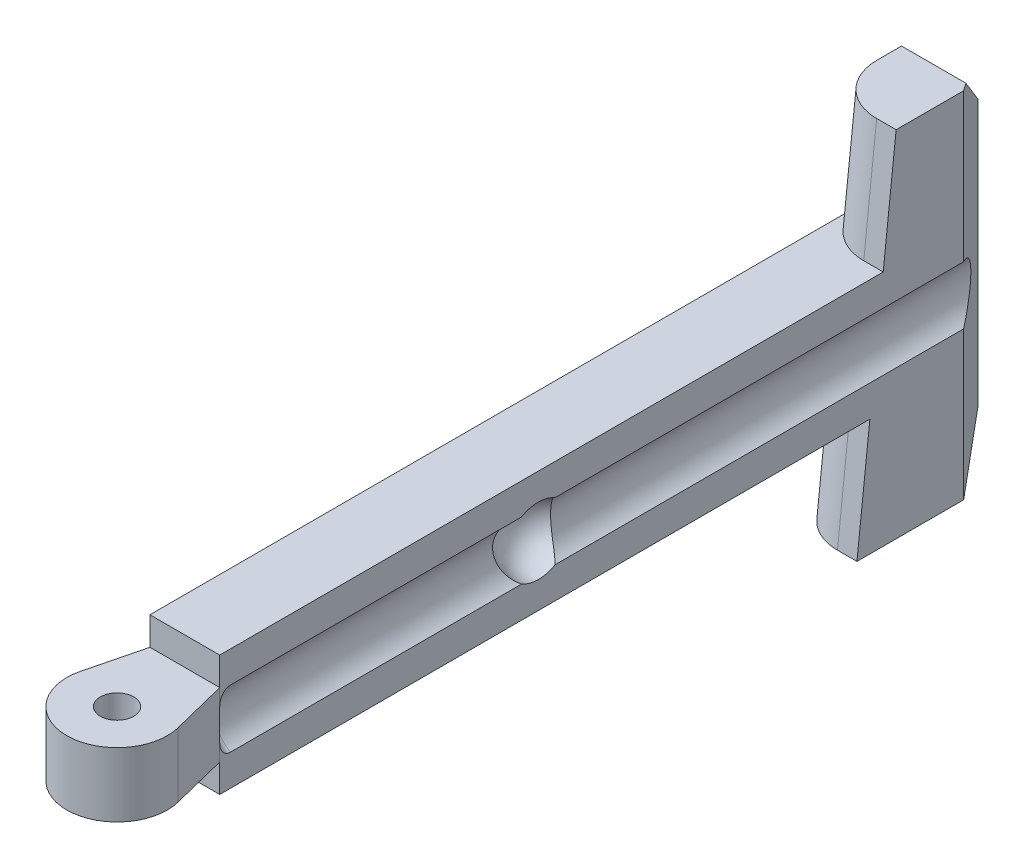
ISO-10303-21;
HEADER;
FILE_DESCRIPTION(('STEP AP214'),'2;1');
FILE_NAME('part.step','',(''),(''),'','','');
FILE_SCHEMA(('AUTOMOTIVE_DESIGN { 1 0 10303 214 1 1 1 1 }'));
ENDSEC;
DATA;
#1=APPLICATION_CONTEXT('core data for automotive mechanical design processes');
#2=APPLICATION_PROTOCOL_DEFINITION('international standard','automotive_design',2000,#1);
#3=PRODUCT_CONTEXT('',#1,'mechanical');
#4=PRODUCT('Part','Part','',(#3));
#5=PRODUCT_RELATED_PRODUCT_CATEGORY('part','',(#4));
#6=PRODUCT_DEFINITION_FORMATION('','',#4);
#7=PRODUCT_DEFINITION_CONTEXT('part definition',#1,'design');
#8=PRODUCT_DEFINITION('design','',#6,#7);
#9=PRODUCT_DEFINITION_SHAPE('','',#8);
#10=(LENGTH_UNIT() NAMED_UNIT(*) SI_UNIT(.MILLI.,.METRE.));
#11=(NAMED_UNIT(*) PLANE_ANGLE_UNIT() SI_UNIT($,.RADIAN.));
#12=(NAMED_UNIT(*) SI_UNIT($,.STERADIAN.) SOLID_ANGLE_UNIT());
#13=UNCERTAINTY_MEASURE_WITH_UNIT(LENGTH_MEASURE(1.E-05),#10,'distance_accuracy_value','');
#14=(GEOMETRIC_REPRESENTATION_CONTEXT(3) GLOBAL_UNCERTAINTY_ASSIGNED_CONTEXT((#13)) GLOBAL_UNIT_ASSIGNED_CONTEXT((#10,
#11,#12)) REPRESENTATION_CONTEXT('',''));
#15=CARTESIAN_POINT('',(0.,0.,0.));
#16=DIRECTION('',(0.,0.,1.));
#17=DIRECTION('',(1.,0.,0.));
#18=AXIS2_PLACEMENT_3D('',#15,#16,#17);
#19=CARTESIAN_POINT('',(8.1915,5.715,0.));
#20=DIRECTION('',(0.,0.,1.));
#21=DIRECTION('',(1.,0.,0.));
#22=AXIS2_PLACEMENT_3D('',#19,#20,#21);
#23=CYLINDRICAL_SURFACE('',#22,3.175);
#24=CARTESIAN_POINT('',(6.6042,8.46474611737156,46.3674999874));
#25=CARTESIAN_POINT('',(6.54632854039955,8.43137032910802,46.4253433169646));
#26=CARTESIAN_POINT('',(6.48775840652472,8.39509654885062,46.4807935458596));
#27=CARTESIAN_POINT('',(6.37034480129714,8.31672156684688,46.5870941060771));
#28=CARTESIAN_POINT('',(6.31150133842682,8.27462054478943,46.6379445791578));
#29=CARTESIAN_POINT('',(6.19455816196645,8.184478025227,46.7353214226762));
#30=CARTESIAN_POINT('',(6.13645994613778,8.13642616338736,46.7818399944587));
#31=CARTESIAN_POINT('',(6.022096145226,8.03452033109729,46.8705758700943));
#32=CARTESIAN_POINT('',(5.96583050956866,7.98066652094186,46.912793292716));
#33=CARTESIAN_POINT('',(5.85596683940452,7.86724366258752,46.9930654672139));
#34=CARTESIAN_POINT('',(5.80237236871986,7.80766727390458,47.0311147349776));
#35=CARTESIAN_POINT('',(5.69874867776966,7.68309101537383,47.1030480874882));
#36=CARTESIAN_POINT('',(5.64872078089119,7.61808915160909,47.136930629506));
#37=CARTESIAN_POINT('',(5.5531017445717,7.48313680085531,47.2004822411527));
#38=CARTESIAN_POINT('',(5.50750369846407,7.4131943208387,47.2301579040987));
#39=CARTESIAN_POINT('',(5.42134153026287,7.26868140425682,47.2853664938455));
#40=CARTESIAN_POINT('',(5.38077912576272,7.19410940155895,47.3108980080378));
#41=CARTESIAN_POINT('',(5.30698969663034,7.04424523798684,47.3567609487229));
#42=CARTESIAN_POINT('',(5.27351922002603,6.96912764144502,47.3772711418248));
#43=CARTESIAN_POINT('',(5.21224005600192,6.8156657348738,47.4144626840858));
#44=CARTESIAN_POINT('',(5.18443349235716,6.73732022767751,47.4311425973175));
#45=CARTESIAN_POINT('',(5.13490881391391,6.57803262427658,47.4606363389118));
#46=CARTESIAN_POINT('',(5.11318925848011,6.4970911475324,47.4734510821137));
#47=CARTESIAN_POINT('',(5.07613886194431,6.33324047703155,47.4952010786822));
#48=CARTESIAN_POINT('',(5.06081026176028,6.25033060383055,47.5041349713173));
#49=CARTESIAN_POINT('',(5.02633365819179,6.01035253810984,47.5241820658947));
#50=CARTESIAN_POINT('',(5.01548014635585,5.85156759756673,47.5304203399913));
#51=CARTESIAN_POINT('',(5.01767287677517,5.53434899155869,47.5291526256738));
#52=CARTESIAN_POINT('',(5.03071107896121,5.37591522587919,47.5216512609406));
#53=CARTESIAN_POINT('',(5.07937164792048,5.06766539913477,47.4933247855766));
#54=CARTESIAN_POINT('',(5.11445222979581,4.91773412671419,47.4728191993957));
#55=CARTESIAN_POINT('',(5.20497893954741,4.62662724517717,47.4189068152738));
#56=CARTESIAN_POINT('',(5.26042487599055,4.48545155377336,47.3855001386022));
#57=CARTESIAN_POINT('',(5.39033402241834,4.2125305247644,47.3051149361776));
#58=CARTESIAN_POINT('',(5.46516691568257,4.08104069034398,47.257869945205));
#59=CARTESIAN_POINT('',(5.62968811063566,3.83356136450627,47.1501166291756));
#60=CARTESIAN_POINT('',(5.71938608415314,3.71758205423334,47.0895996604837));
#61=CARTESIAN_POINT('',(5.86442662884316,3.55372013773693,46.9869076054976));
#62=CARTESIAN_POINT('',(5.91609605197397,3.49945674758304,46.9494845882161));
#63=CARTESIAN_POINT('',(6.0216027449944,3.39603145716119,46.8708494065036));
#64=CARTESIAN_POINT('',(6.07543938621494,3.3468680920645,46.8296383365266));
#65=CARTESIAN_POINT('',(6.18442651520554,3.25381878879911,46.7434012595874));
#66=CARTESIAN_POINT('',(6.23957530265048,3.20992642363425,46.6983800150476));
#67=CARTESIAN_POINT('',(6.35037996367811,3.12740122738407,46.6043733969433));
#68=CARTESIAN_POINT('',(6.4060355526986,3.0887656181694,46.5553901392498));
#69=CARTESIAN_POINT('',(6.48540643417933,3.03718615360758,46.4823092620454));
#70=CARTESIAN_POINT('',(6.50930408566586,3.02211642598316,46.4598836096828));
#71=CARTESIAN_POINT('',(6.55690813958296,2.99295801045824,46.4142721722575));
#72=CARTESIAN_POINT('',(6.58061473259098,2.97886819865626,46.3910873044257));
#73=CARTESIAN_POINT('',(6.60420000000057,2.9652538826279,46.367499987401));
#74=B_SPLINE_CURVE_WITH_KNOTS('',3,(#24,#25,#26,#27,#28,#29,#30,#31,#32,#33,#34,#35,#36,#37,#38,
#39,#40,#41,#42,#43,#44,#45,#46,#47,#48,#49,#50,#51,#52,#53,#54,#55,#56,#57,#58,#59,#60,#61,#62,
#63,#64,#65,#66,#67,#68,#69,#70,#71,#72,#73),.UNSPECIFIED.,.F.,.F.,(4,2,2,2,2,2,2,2,2,2,2,2,2,2,
2,2,2,2,2,2,2,2,2,2,4),(0.,0.265003280744025,0.529998391664567,0.7954617016409,1.0609176793325,
1.32671883014334,1.59261809934534,1.85809591277295,2.12366402996642,2.37760174699898,
2.63163450747659,2.88560709418652,3.13966865884104,3.61493219424178,4.09003582273924,
4.55389553351147,5.01775088414149,5.49120204201679,5.96496246475927,6.2159995075178,
6.46696424663424,6.7176198055873,6.96814237738206,7.07633689918983,7.18440520930127),.UNSPECIFIED.);
#75=CARTESIAN_POINT('',(6.604,8.46463065701559,46.3677));
#76=VERTEX_POINT('',#75);
#77=CARTESIAN_POINT('',(6.604,2.96536934298441,46.3677));
#78=VERTEX_POINT('',#77);
#79=EDGE_CURVE('E11',#76,#78,#74,.T.);
#80=ORIENTED_EDGE('',*,*,#79,.F.);
#81=DIRECTION('',(0.,0.,1.));
#82=VECTOR('',#81,1.);
#83=CARTESIAN_POINT('',(6.604,8.46463065701559,0.));
#84=LINE('',#83,#82);
#85=CARTESIAN_POINT('',(6.604,8.46463065701559,73.914));
#86=VERTEX_POINT('',#85);
#87=EDGE_CURVE('E219',#86,#76,#84,.F.);
#88=ORIENTED_EDGE('',*,*,#87,.F.);
#89=CARTESIAN_POINT('',(8.1915,5.715,73.914));
#90=DIRECTION('',(0.,0.,1.));
#91=DIRECTION('',(1.,0.,0.));
#92=AXIS2_PLACEMENT_3D('',#89,#90,#91);
#93=CIRCLE('',#92,3.175);
#94=CARTESIAN_POINT('',(6.604,2.96536934298441,73.914));
#95=VERTEX_POINT('',#94);
#96=EDGE_CURVE('E342',#86,#95,#93,.T.);
#97=ORIENTED_EDGE('',*,*,#96,.T.);
#98=DIRECTION('',(0.,0.,1.));
#99=VECTOR('',#98,1.);
#100=CARTESIAN_POINT('',(6.604,2.96536934298441,0.));
#101=LINE('',#100,#99);
#102=EDGE_CURVE('E227',#78,#95,#101,.T.);
#103=ORIENTED_EDGE('',*,*,#102,.F.);
#104=EDGE_LOOP('',(#80,#88,#97,#103));
#105=FACE_BOUND('',#104,.T.);
#106=ADVANCED_FACE('F43',(#105),#23,.F.);
#107=CARTESIAN_POINT('',(6.6042,2.96525388262843,43.1929000126));
#108=CARTESIAN_POINT('',(6.54632854039955,2.99862967089198,43.1350566830354));
#109=CARTESIAN_POINT('',(6.48775840652472,3.03490345114938,43.0796064541404));
#110=CARTESIAN_POINT('',(6.37034480129714,3.11327843315312,42.9733058939229));
#111=CARTESIAN_POINT('',(6.31150133842682,3.15537945521057,42.9224554208422));
#112=CARTESIAN_POINT('',(6.19455816196645,3.245521974773,42.8250785773238));
#113=CARTESIAN_POINT('',(6.13645994613778,3.29357383661264,42.7785600055413));
#114=CARTESIAN_POINT('',(6.022096145226,3.39547966890271,42.6898241299057));
#115=CARTESIAN_POINT('',(5.96583050956866,3.44933347905814,42.647606707284));
#116=CARTESIAN_POINT('',(5.85596683940452,3.56275633741248,42.5673345327861));
#117=CARTESIAN_POINT('',(5.80237236871986,3.62233272609541,42.5292852650224));
#118=CARTESIAN_POINT('',(5.69874867776966,3.74690898462617,42.4573519125118));
#119=CARTESIAN_POINT('',(5.64872078089119,3.81191084839091,42.423469370494));
#120=CARTESIAN_POINT('',(5.5531017445717,3.94686319914469,42.3599177588473));
#121=CARTESIAN_POINT('',(5.50750369846407,4.0168056791613,42.3302420959013));
#122=CARTESIAN_POINT('',(5.42134153026287,4.16131859574318,42.2750335061545));
#123=CARTESIAN_POINT('',(5.38077912576272,4.23589059844105,42.2495019919622));
#124=CARTESIAN_POINT('',(5.30698969663034,4.38575476201315,42.2036390512771));
#125=CARTESIAN_POINT('',(5.27351922002603,4.46087235855498,42.1831288581752));
#126=CARTESIAN_POINT('',(5.21224005600192,4.6143342651262,42.1459373159142));
#127=CARTESIAN_POINT('',(5.18443349235716,4.69267977232249,42.1292574026825));
#128=CARTESIAN_POINT('',(5.13490881391391,4.85196737572342,42.0997636610882));
#129=CARTESIAN_POINT('',(5.11318925848011,4.93290885246759,42.0869489178863));
#130=CARTESIAN_POINT('',(5.07613886194431,5.09675952296845,42.0651989213178));
#131=CARTESIAN_POINT('',(5.06081026176028,5.17966939616945,42.0562650286827));
#132=CARTESIAN_POINT('',(5.02633365819179,5.41964746189015,42.0362179341053));
#133=CARTESIAN_POINT('',(5.01548014635585,5.57843240243327,42.0299796600087));
#134=CARTESIAN_POINT('',(5.01767287677517,5.89565100844131,42.0312473743262));
#135=CARTESIAN_POINT('',(5.03071107896121,6.05408477412081,42.0387487390594));
#136=CARTESIAN_POINT('',(5.07937164792048,6.36233460086523,42.0670752144234));
#137=CARTESIAN_POINT('',(5.11445222979581,6.51226587328581,42.0875808006043));
#138=CARTESIAN_POINT('',(5.20497893954741,6.80337275482283,42.1414931847262));
#139=CARTESIAN_POINT('',(5.26042487599055,6.94454844622664,42.1748998613978));
#140=CARTESIAN_POINT('',(5.39033402241834,7.21746947523559,42.2552850638224));
#141=CARTESIAN_POINT('',(5.46516691568257,7.34895930965602,42.302530054795));
#142=CARTESIAN_POINT('',(5.62968811063565,7.59643863549373,42.4102833708244));
#143=CARTESIAN_POINT('',(5.71938608415313,7.71241794576666,42.4708003395163));
#144=CARTESIAN_POINT('',(5.86442662884316,7.87627986226307,42.5734923945024));
#145=CARTESIAN_POINT('',(5.91609605197397,7.93054325241695,42.6109154117839));
#146=CARTESIAN_POINT('',(6.02160274499439,8.03396854283881,42.6895505934964));
#147=CARTESIAN_POINT('',(6.07543938621494,8.0831319079355,42.7307616634734));
#148=CARTESIAN_POINT('',(6.18442651520554,8.17618121120089,42.8169987404126));
#149=CARTESIAN_POINT('',(6.23957530265048,8.22007357636575,42.8620199849523));
#150=CARTESIAN_POINT('',(6.35037996367811,8.30259877261593,42.9560266030566));
#151=CARTESIAN_POINT('',(6.4060355526986,8.34123438183059,43.0050098607502));
#152=CARTESIAN_POINT('',(6.48540643417933,8.39281384639242,43.0780907379546));
#153=CARTESIAN_POINT('',(6.50930408566585,8.40788357401684,43.1005163903172));
#154=CARTESIAN_POINT('',(6.55690813958296,8.43704198954175,43.1461278277424));
#155=CARTESIAN_POINT('',(6.58061473259098,8.45113180134373,43.1693126955743));
#156=CARTESIAN_POINT('',(6.60420000000057,8.46474611737209,43.192900012599));
#157=B_SPLINE_CURVE_WITH_KNOTS('',3,(#107,#108,#109,#110,#111,#112,#113,#114,#115,#116,#117,
#118,#119,#120,#121,#122,#123,#124,#125,#126,#127,#128,#129,#130,#131,#132,#133,#134,#135,#136,
#137,#138,#139,#140,#141,#142,#143,#144,#145,#146,#147,#148,#149,#150,#151,#152,#153,#154,#155,
#156),.UNSPECIFIED.,.F.,.F.,(4,2,2,2,2,2,2,2,2,2,2,2,2,2,2,2,2,2,2,2,2,2,2,2,4),(0.,
0.265003280744028,0.529998391664569,0.795461701640902,1.0609176793325,1.32671883014333,
1.59261809934534,1.85809591277295,2.12366402996642,2.37760174699898,2.63163450747659,
2.88560709418652,3.13966865884104,3.61493219424178,4.09003582273924,4.55389553351147,
5.01775088414149,5.49120204201678,5.96496246475927,6.21599950751779,6.46696424663423,
6.71761980558729,6.96814237738206,7.07633689918983,7.18440520930126),.UNSPECIFIED.);
#158=CARTESIAN_POINT('',(6.604,2.96536934298441,43.1927));
#159=VERTEX_POINT('',#158);
#160=CARTESIAN_POINT('',(6.604,8.46463065701559,43.1927));
#161=VERTEX_POINT('',#160);
#162=EDGE_CURVE('E58',#159,#161,#157,.T.);
#163=ORIENTED_EDGE('',*,*,#162,.F.);
#164=CARTESIAN_POINT('',(6.604,2.96536934298441,4.53436992140621));
#165=VERTEX_POINT('',#164);
#166=EDGE_CURVE('E232',#165,#159,#101,.T.);
#167=ORIENTED_EDGE('',*,*,#166,.F.);
#168=CARTESIAN_POINT('',(8.1915,5.715,6.80155488210931));
#169=DIRECTION('',(0.819152044288991,0.,-0.573576436351047));
#170=DIRECTION('',(0.573576436351047,0.,0.819152044288991));
#171=AXIS2_PLACEMENT_3D('',#168,#169,#170);
#172=ELLIPSE('',#171,5.53544357609698,3.175);
#173=CARTESIAN_POINT('',(6.604,8.46463065701559,4.53436992140621));
#174=VERTEX_POINT('',#173);
#175=EDGE_CURVE('E223',#165,#174,#172,.T.);
#176=ORIENTED_EDGE('',*,*,#175,.T.);
#177=EDGE_CURVE('E216',#161,#174,#84,.F.);
#178=ORIENTED_EDGE('',*,*,#177,.F.);
#179=EDGE_LOOP('',(#163,#167,#176,#178));
#180=FACE_BOUND('',#179,.T.);
#181=ADVANCED_FACE('F221',(#180),#23,.F.);
#182=CARTESIAN_POINT('',(0.,0.,74.93));
#183=DIRECTION('',(0.,0.,-1.));
#184=DIRECTION('',(-1.,0.,0.));
#185=AXIS2_PLACEMENT_3D('',#182,#183,#184);
#186=PLANE('',#185);
#187=DIRECTION('',(1.,0.,0.));
#188=VECTOR('',#187,1.);
#189=CARTESIAN_POINT('',(0.,2.667,74.93));
#190=LINE('',#189,#188);
#191=CARTESIAN_POINT('',(0.,2.667,74.93));
#192=VERTEX_POINT('',#191);
#193=CARTESIAN_POINT('',(6.604,2.667,74.93));
#194=VERTEX_POINT('',#193);
#195=EDGE_CURVE('E504',#192,#194,#190,.T.);
#196=ORIENTED_EDGE('',*,*,#195,.F.);
#197=DIRECTION('',(0.,-1.,0.));
#198=VECTOR('',#197,1.);
#199=CARTESIAN_POINT('',(0.,0.,74.93));
#200=LINE('',#199,#198);
#201=CARTESIAN_POINT('',(0.,0.,74.93));
#202=VERTEX_POINT('',#201);
#203=EDGE_CURVE('E255',#192,#202,#200,.T.);
#204=ORIENTED_EDGE('',*,*,#203,.T.);
#205=DIRECTION('',(1.,0.,0.));
#206=VECTOR('',#205,1.);
#207=CARTESIAN_POINT('',(0.,0.,74.93));
#208=LINE('',#207,#206);
#209=CARTESIAN_POINT('',(6.604,0.,74.93));
#210=VERTEX_POINT('',#209);
#211=EDGE_CURVE('E263',#202,#210,#208,.T.);
#212=ORIENTED_EDGE('',*,*,#211,.T.);
#213=DIRECTION('',(0.,1.,0.));
#214=VECTOR('',#213,1.);
#215=CARTESIAN_POINT('',(6.604,0.,74.93));
#216=LINE('',#215,#214);
#217=EDGE_CURVE('E266',#210,#194,#216,.T.);
#218=ORIENTED_EDGE('',*,*,#217,.T.);
#219=EDGE_LOOP('',(#196,#204,#212,#218));
#220=FACE_BOUND('',#219,.T.);
#221=ADVANCED_FACE('F427',(#220),#186,.F.);
#222=CARTESIAN_POINT('',(6.604,0.,74.93));
#223=DIRECTION('',(-1.,0.,0.));
#224=DIRECTION('',(0.,0.,1.));
#225=AXIS2_PLACEMENT_3D('',#222,#223,#224);
#226=PLANE('',#225);
#227=CARTESIAN_POINT('',(6.604,5.715,44.7802));
#228=DIRECTION('',(-1.,0.,0.));
#229=DIRECTION('',(0.,0.,1.));
#230=AXIS2_PLACEMENT_3D('',#227,#228,#229);
#231=CIRCLE('',#230,3.175);
#232=EDGE_CURVE('E64',#78,#159,#231,.F.);
#233=ORIENTED_EDGE('',*,*,#232,.F.);
#234=ORIENTED_EDGE('',*,*,#102,.T.);
#235=CARTESIAN_POINT('',(6.604,2.96536934298441,73.914));
#236=CARTESIAN_POINT('',(6.604,2.96536824984096,73.9395560988535));
#237=CARTESIAN_POINT('',(6.604,2.96648357248619,73.9650991688787));
#238=CARTESIAN_POINT('',(6.604,2.97092421987183,74.0159864045722));
#239=CARTESIAN_POINT('',(6.604,2.97424901359836,74.0413306165526));
#240=CARTESIAN_POINT('',(6.604,2.98746504721256,74.1166013784526));
#241=CARTESIAN_POINT('',(6.604,3.0005984151228,74.1659953129554));
#242=CARTESIAN_POINT('',(6.604,3.03494596590338,74.2618185129588));
#243=CARTESIAN_POINT('',(6.604,3.05615657073126,74.3082490805491));
#244=CARTESIAN_POINT('',(6.604,3.10580885666264,74.3970919762127));
#245=CARTESIAN_POINT('',(6.604,3.13425543138219,74.4395015581815));
#246=CARTESIAN_POINT('',(6.604,3.19851382485459,74.5209272682253));
#247=CARTESIAN_POINT('',(6.604,3.23456263779898,74.5597554955253));
#248=CARTESIAN_POINT('',(6.604,3.31203101810366,74.6315423432405));
#249=CARTESIAN_POINT('',(6.604,3.35344894626895,74.6645027478472));
#250=CARTESIAN_POINT('',(6.604,3.44551001464027,74.7278151506046));
#251=CARTESIAN_POINT('',(6.604,3.49666589430168,74.7574193381724));
#252=CARTESIAN_POINT('',(6.604,3.60273191353758,74.8091844442958));
#253=CARTESIAN_POINT('',(6.604,3.65765261296734,74.8313233020369));
#254=CARTESIAN_POINT('',(6.604,3.80050655426578,74.8785959220487));
#255=CARTESIAN_POINT('',(6.604,3.89010068584738,74.8987718549743));
#256=CARTESIAN_POINT('',(6.604,4.02551188933772,74.9180385497529));
#257=CARTESIAN_POINT('',(6.604,4.07069271250363,74.9226302543415));
#258=CARTESIAN_POINT('',(6.604,4.16116074118679,74.9286053735015));
#259=CARTESIAN_POINT('',(6.604,4.20644742145354,74.9299965566462));
#260=CARTESIAN_POINT('',(6.604,4.25174173503103,74.93));
#261=B_SPLINE_CURVE_WITH_KNOTS('',3,(#235,#236,#237,#238,#239,#240,#241,#242,#243,#244,#245,
#246,#247,#248,#249,#250,#251,#252,#253,#254,#255,#256,#257,#258,#259,#260),.UNSPECIFIED.,.F.,
.F.,(4,2,2,2,2,2,2,2,2,2,2,2,4),(0.,0.0766184519498525,0.153218496437952,0.305740063631712,
0.458194145493392,0.610751605965816,0.76905333422839,0.927306846175707,1.10394429694954,
1.28109924646107,1.55492306320677,1.69108449168074,1.82691506745631),.UNSPECIFIED.);
#262=CARTESIAN_POINT('',(6.604,4.25174173503103,74.93));
#263=VERTEX_POINT('',#262);
#264=EDGE_CURVE('E348',#95,#263,#261,.T.);
#265=ORIENTED_EDGE('',*,*,#264,.T.);
#266=DIRECTION('',(0.,1.,0.));
#267=VECTOR('',#266,1.);
#268=CARTESIAN_POINT('',(6.604,2.667,74.93));
#269=LINE('',#268,#267);
#270=EDGE_CURVE('E73',#194,#263,#269,.T.);
#271=ORIENTED_EDGE('',*,*,#270,.F.);
#272=ORIENTED_EDGE('',*,*,#217,.F.);
#273=DIRECTION('',(0.,0.,-1.));
#274=VECTOR('',#273,1.);
#275=CARTESIAN_POINT('',(6.604,0.,74.93));
#276=LINE('',#275,#274);
#277=CARTESIAN_POINT('',(6.604,0.,13.4083136363636));
#278=VERTEX_POINT('',#277);
#279=EDGE_CURVE('E276',#210,#278,#276,.T.);
#280=ORIENTED_EDGE('',*,*,#279,.T.);
#281=DIRECTION('',(0.,0.993938707355458,-0.109935644904467));
#282=VECTOR('',#281,1.);
#283=CARTESIAN_POINT('',(6.604,0.,13.4083136363636));
#284=LINE('',#283,#282);
#285=CARTESIAN_POINT('',(6.604,-11.049,14.6304));
#286=VERTEX_POINT('',#285);
#287=EDGE_CURVE('E235',#286,#278,#284,.T.);
#288=ORIENTED_EDGE('',*,*,#287,.F.);
#289=DIRECTION('',(0.,0.,-1.));
#290=VECTOR('',#289,1.);
#291=CARTESIAN_POINT('',(6.604,-11.049,0.));
#292=LINE('',#291,#290);
#293=CARTESIAN_POINT('',(6.604,-11.049,4.54058118778393));
#294=VERTEX_POINT('',#293);
#295=EDGE_CURVE('E252',#286,#294,#292,.T.);
#296=ORIENTED_EDGE('',*,*,#295,.T.);
#297=DIRECTION('',(0.,-0.642787609686542,0.766044443118976));
#298=VECTOR('',#297,1.);
#299=CARTESIAN_POINT('',(6.604,-11.049,4.54058118778393));
#300=LINE('',#299,#298);
#301=CARTESIAN_POINT('',(6.604,-11.0437881286733,4.53436992140621));
#302=VERTEX_POINT('',#301);
#303=EDGE_CURVE('E340',#294,#302,#300,.F.);
#304=ORIENTED_EDGE('',*,*,#303,.T.);
#305=DIRECTION('',(0.,1.,0.));
#306=VECTOR('',#305,1.);
#307=CARTESIAN_POINT('',(6.604,0.,4.53436992140621));
#308=LINE('',#307,#306);
#309=EDGE_CURVE('E315',#302,#165,#308,.T.);
#310=ORIENTED_EDGE('',*,*,#309,.T.);
#311=ORIENTED_EDGE('',*,*,#166,.T.);
#312=EDGE_LOOP('',(#233,#234,#265,#271,#272,#280,#288,#296,#304,#310,#311));
#313=FACE_BOUND('',#312,.T.);
#314=ADVANCED_FACE('F366',(#313),#226,.F.);
#315=CARTESIAN_POINT('',(0.,11.43,74.93));
#316=DIRECTION('',(0.,-1.,0.));
#317=DIRECTION('',(0.,0.,-1.));
#318=AXIS2_PLACEMENT_3D('',#315,#316,#317);
#319=PLANE('',#318);
#320=DIRECTION('',(0.,0.,-1.));
#321=VECTOR('',#320,1.);
#322=CARTESIAN_POINT('',(6.604,11.43,74.93));
#323=LINE('',#322,#321);
#324=CARTESIAN_POINT('',(6.604,11.43,74.93));
#325=VERTEX_POINT('',#324);
#326=CARTESIAN_POINT('',(6.604,11.43,12.1440863636364));
#327=VERTEX_POINT('',#326);
#328=EDGE_CURVE('E273',#325,#327,#323,.T.);
#329=ORIENTED_EDGE('',*,*,#328,.T.);
#330=DIRECTION('',(1.,0.,0.));
#331=VECTOR('',#330,1.);
#332=CARTESIAN_POINT('',(0.,11.43,12.1440863636364));
#333=LINE('',#332,#331);
#334=CARTESIAN_POINT('',(4.7625,11.43,12.1440863636364));
#335=VERTEX_POINT('',#334);
#336=EDGE_CURVE('E239',#335,#327,#333,.T.);
#337=ORIENTED_EDGE('',*,*,#336,.F.);
#338=CARTESIAN_POINT('',(4.7625,11.43,7.35254341963387));
#339=DIRECTION('',(0.,-1.,0.));
#340=DIRECTION('',(0.,0.,-1.));
#341=AXIS2_PLACEMENT_3D('',#338,#339,#340);
#342=ELLIPSE('',#341,4.79154294400249,4.7625);
#343=CARTESIAN_POINT('',(0.,11.43,7.35254341963387));
#344=VERTEX_POINT('',#343);
#345=EDGE_CURVE('E298',#335,#344,#342,.T.);
#346=ORIENTED_EDGE('',*,*,#345,.T.);
#347=DIRECTION('',(0.,0.,-1.));
#348=VECTOR('',#347,1.);
#349=CARTESIAN_POINT('',(0.,11.43,74.93));
#350=LINE('',#349,#348);
#351=CARTESIAN_POINT('',(0.,11.43,74.93));
#352=VERTEX_POINT('',#351);
#353=EDGE_CURVE('E271',#352,#344,#350,.T.);
#354=ORIENTED_EDGE('',*,*,#353,.F.);
#355=DIRECTION('',(-1.,0.,0.));
#356=VECTOR('',#355,1.);
#357=CARTESIAN_POINT('',(0.,11.43,74.93));
#358=LINE('',#357,#356);
#359=EDGE_CURVE('E268',#325,#352,#358,.T.);
#360=ORIENTED_EDGE('',*,*,#359,.F.);
#361=EDGE_LOOP('',(#329,#337,#346,#354,#360));
#362=FACE_BOUND('',#361,.T.);
#363=ADVANCED_FACE('F367',(#362),#319,.F.);
#364=CARTESIAN_POINT('',(0.,0.,74.93));
#365=DIRECTION('',(1.,0.,0.));
#366=DIRECTION('',(0.,0.,-1.));
#367=AXIS2_PLACEMENT_3D('',#364,#365,#366);
#368=PLANE('',#367);
#369=DIRECTION('',(0.,0.,-1.));
#370=VECTOR('',#369,1.);
#371=CARTESIAN_POINT('',(0.,22.479,0.));
#372=LINE('',#371,#370);
#373=CARTESIAN_POINT('',(0.,22.479,6.1304570559975));
#374=VERTEX_POINT('',#373);
#375=CARTESIAN_POINT('',(0.,22.479,3.81));
#376=VERTEX_POINT('',#375);
#377=EDGE_CURVE('E249',#374,#376,#372,.T.);
#378=ORIENTED_EDGE('',*,*,#377,.T.);
#379=DIRECTION('',(0.,0.766044443118976,0.642787609686541));
#380=VECTOR('',#379,1.);
#381=CARTESIAN_POINT('',(0.,17.9384188122161,0.));
#382=LINE('',#381,#380);
#383=CARTESIAN_POINT('',(0.,21.7222364687027,3.17500000000003));
#384=VERTEX_POINT('',#383);
#385=EDGE_CURVE('E331',#376,#384,#382,.F.);
#386=ORIENTED_EDGE('',*,*,#385,.T.);
#387=DIRECTION('',(0.,-1.,0.));
#388=VECTOR('',#387,1.);
#389=CARTESIAN_POINT('',(0.,-11.049,3.17500000000003));
#390=LINE('',#389,#388);
#391=CARTESIAN_POINT('',(0.,-9.90314132898788,3.17500000000003));
#392=VERTEX_POINT('',#391);
#393=EDGE_CURVE('E301',#384,#392,#390,.T.);
#394=ORIENTED_EDGE('',*,*,#393,.T.);
#395=DIRECTION('',(0.,0.642787609686542,-0.766044443118976));
#396=VECTOR('',#395,1.);
#397=CARTESIAN_POINT('',(0.,-11.049,4.54058118778393));
#398=LINE('',#397,#396);
#399=CARTESIAN_POINT('',(0.,-11.049,4.54058118778393));
#400=VERTEX_POINT('',#399);
#401=EDGE_CURVE('E329',#392,#400,#398,.F.);
#402=ORIENTED_EDGE('',*,*,#401,.T.);
#403=DIRECTION('',(0.,0.,1.));
#404=VECTOR('',#403,1.);
#405=CARTESIAN_POINT('',(0.,-11.049,0.));
#406=LINE('',#405,#404);
#407=CARTESIAN_POINT('',(0.,-11.049,9.8388570559975));
#408=VERTEX_POINT('',#407);
#409=EDGE_CURVE('E253',#400,#408,#406,.T.);
#410=ORIENTED_EDGE('',*,*,#409,.T.);
#411=DIRECTION('',(0.,0.993938707355458,-0.109935644904467));
#412=VECTOR('',#411,1.);
#413=CARTESIAN_POINT('',(0.,-7.24599966897625,9.41822217089941));
#414=LINE('',#413,#412);
#415=CARTESIAN_POINT('',(0.,0.,8.61677069236115));
#416=VERTEX_POINT('',#415);
#417=EDGE_CURVE('E284',#408,#416,#414,.T.);
#418=ORIENTED_EDGE('',*,*,#417,.T.);
#419=DIRECTION('',(0.,0.,-1.));
#420=VECTOR('',#419,1.);
#421=CARTESIAN_POINT('',(0.,0.,74.93));
#422=LINE('',#421,#420);
#423=EDGE_CURVE('E279',#202,#416,#422,.T.);
#424=ORIENTED_EDGE('',*,*,#423,.F.);
#425=ORIENTED_EDGE('',*,*,#203,.F.);
#426=DIRECTION('',(0.,1.,0.));
#427=VECTOR('',#426,1.);
#428=CARTESIAN_POINT('',(0.,2.667,74.93));
#429=LINE('',#428,#427);
#430=CARTESIAN_POINT('',(0.,8.763,74.93));
#431=VERTEX_POINT('',#430);
#432=EDGE_CURVE('E228',#192,#431,#429,.T.);
#433=ORIENTED_EDGE('',*,*,#432,.T.);
#434=EDGE_CURVE('E260',#352,#431,#200,.T.);
#435=ORIENTED_EDGE('',*,*,#434,.F.);
#436=ORIENTED_EDGE('',*,*,#353,.T.);
#437=DIRECTION('',(0.,0.993938707355458,-0.109935644904467));
#438=VECTOR('',#437,1.);
#439=CARTESIAN_POINT('',(0.,-7.24599966897628,9.41822217089941));
#440=LINE('',#439,#438);
#441=EDGE_CURVE('E281',#344,#374,#440,.T.);
#442=ORIENTED_EDGE('',*,*,#441,.T.);
#443=EDGE_LOOP('',(#378,#386,#394,#402,#410,#418,#424,#425,#433,#435,#436,#442));
#444=FACE_BOUND('',#443,.T.);
#445=ADVANCED_FACE('F372',(#444),#368,.F.);
#446=CARTESIAN_POINT('',(0.,0.,74.93));
#447=DIRECTION('',(0.,1.,0.));
#448=DIRECTION('',(0.,0.,1.));
#449=AXIS2_PLACEMENT_3D('',#446,#447,#448);
#450=PLANE('',#449);
#451=ORIENTED_EDGE('',*,*,#423,.T.);
#452=CARTESIAN_POINT('',(4.7625,0.,8.61677069236115));
#453=DIRECTION('',(0.,1.,0.));
#454=DIRECTION('',(0.,0.,-1.));
#455=AXIS2_PLACEMENT_3D('',#452,#453,#454);
#456=ELLIPSE('',#455,4.79154294400249,4.7625);
#457=CARTESIAN_POINT('',(4.7625,0.,13.4083136363636));
#458=VERTEX_POINT('',#457);
#459=EDGE_CURVE('E296',#416,#458,#456,.T.);
#460=ORIENTED_EDGE('',*,*,#459,.T.);
#461=DIRECTION('',(1.,0.,0.));
#462=VECTOR('',#461,1.);
#463=CARTESIAN_POINT('',(0.,0.,13.4083136363636));
#464=LINE('',#463,#462);
#465=EDGE_CURVE('E238',#458,#278,#464,.T.);
#466=ORIENTED_EDGE('',*,*,#465,.T.);
#467=ORIENTED_EDGE('',*,*,#279,.F.);
#468=ORIENTED_EDGE('',*,*,#211,.F.);
#469=EDGE_LOOP('',(#451,#460,#466,#467,#468));
#470=FACE_BOUND('',#469,.T.);
#471=ADVANCED_FACE('F365',(#470),#450,.F.);
#472=CARTESIAN_POINT('',(6.604,5.715,44.7802));
#473=DIRECTION('',(-1.,0.,0.));
#474=DIRECTION('',(0.,0.,1.));
#475=AXIS2_PLACEMENT_3D('',#472,#473,#474);
#476=CIRCLE('',#475,3.175);
#477=EDGE_CURVE('E205',#161,#76,#476,.F.);
#478=ORIENTED_EDGE('',*,*,#477,.F.);
#479=ORIENTED_EDGE('',*,*,#177,.T.);
#480=DIRECTION('',(0.,1.,0.));
#481=VECTOR('',#480,1.);
#482=CARTESIAN_POINT('',(6.604,22.479,4.53436992140621));
#483=LINE('',#482,#481);
#484=CARTESIAN_POINT('',(6.604,22.479,4.53436992140621));
#485=VERTEX_POINT('',#484);
#486=EDGE_CURVE('E307',#174,#485,#483,.T.);
#487=ORIENTED_EDGE('',*,*,#486,.T.);
#488=DIRECTION('',(0.,0.,1.));
#489=VECTOR('',#488,1.);
#490=CARTESIAN_POINT('',(6.604,22.479,0.));
#491=LINE('',#490,#489);
#492=CARTESIAN_POINT('',(6.604,22.479,10.922));
#493=VERTEX_POINT('',#492);
#494=EDGE_CURVE('E241',#485,#493,#491,.T.);
#495=ORIENTED_EDGE('',*,*,#494,.T.);
#496=DIRECTION('',(0.,0.993938707355458,-0.109935644904467));
#497=VECTOR('',#496,1.);
#498=CARTESIAN_POINT('',(6.604,11.43,12.1440863636364));
#499=LINE('',#498,#497);
#500=EDGE_CURVE('E234',#327,#493,#499,.T.);
#501=ORIENTED_EDGE('',*,*,#500,.F.);
#502=ORIENTED_EDGE('',*,*,#328,.F.);
#503=CARTESIAN_POINT('',(6.604,8.763,74.93));
#504=VERTEX_POINT('',#503);
#505=EDGE_CURVE('E265',#504,#325,#216,.T.);
#506=ORIENTED_EDGE('',*,*,#505,.F.);
#507=CARTESIAN_POINT('',(6.604,7.17825826496897,74.93));
#508=VERTEX_POINT('',#507);
#509=EDGE_CURVE('E269',#508,#504,#216,.T.);
#510=ORIENTED_EDGE('',*,*,#509,.F.);
#511=CARTESIAN_POINT('',(6.604,7.17825826496897,74.93));
#512=CARTESIAN_POINT('',(6.604,7.22092690868681,74.9299982858573));
#513=CARTESIAN_POINT('',(6.604,7.26359136252264,74.9287631236386));
#514=CARTESIAN_POINT('',(6.604,7.34882252472981,74.9234805982905));
#515=CARTESIAN_POINT('',(6.604,7.39138889817205,74.9194279485186));
#516=CARTESIAN_POINT('',(6.604,7.51917471634204,74.9024488205808));
#517=CARTESIAN_POINT('',(6.604,7.60386066039769,74.8846909423367));
#518=CARTESIAN_POINT('',(6.604,7.75045948238755,74.8397721689592));
#519=CARTESIAN_POINT('',(6.604,7.81327145811285,74.815553830466));
#520=CARTESIAN_POINT('',(6.604,7.93412867621724,74.7574433494598));
#521=CARTESIAN_POINT('',(6.604,7.99218661542404,74.7235781335598));
#522=CARTESIAN_POINT('',(6.604,8.10195739912679,74.6456598794377));
#523=CARTESIAN_POINT('',(6.604,8.153602682221,74.6015105030295));
#524=CARTESIAN_POINT('',(6.604,8.24725861115383,74.5038450869544));
#525=CARTESIAN_POINT('',(6.604,8.28926981154168,74.4503295867255));
#526=CARTESIAN_POINT('',(6.604,8.35607014071808,74.34358552818));
#527=CARTESIAN_POINT('',(6.604,8.38243816271802,74.2913424906499));
#528=CARTESIAN_POINT('',(6.604,8.42468603552425,74.1828203081438));
#529=CARTESIAN_POINT('',(6.604,8.44058816557376,74.1265500213438));
#530=CARTESIAN_POINT('',(6.604,8.45541789129511,74.0437004216907));
#531=CARTESIAN_POINT('',(6.604,8.45887020293208,74.0178653285968));
#532=CARTESIAN_POINT('',(6.604,8.46347493966574,73.9660255590641));
#533=CARTESIAN_POINT('',(6.604,8.46463040546848,73.9400211526195));
#534=CARTESIAN_POINT('',(6.604,8.46463065701559,73.914));
#535=B_SPLINE_CURVE_WITH_KNOTS('',3,(#511,#512,#513,#514,#515,#516,#517,#518,#519,#520,#521,
#522,#523,#524,#525,#526,#527,#528,#529,#530,#531,#532,#533,#534),.UNSPECIFIED.,.F.,.F.,(4,2,2,
2,2,2,2,2,2,2,2,4),(0.,0.127967329906963,0.256175423924312,0.514436824695902,0.71566471752159,
0.916336350834211,1.11896929795031,1.32159057834439,1.49616673460715,1.67037004981453,
1.74847840867379,1.8264832938245),.UNSPECIFIED.);
#536=EDGE_CURVE('E211',#508,#86,#535,.T.);
#537=ORIENTED_EDGE('',*,*,#536,.T.);
#538=ORIENTED_EDGE('',*,*,#87,.T.);
#539=EDGE_LOOP('',(#478,#479,#487,#495,#501,#502,#506,#510,#537,#538));
#540=FACE_BOUND('',#539,.T.);
#541=ADVANCED_FACE('F214',(#540),#226,.F.);
#542=ORIENTED_EDGE('',*,*,#434,.T.);
#543=DIRECTION('',(1.,0.,0.));
#544=VECTOR('',#543,1.);
#545=CARTESIAN_POINT('',(0.,8.763,74.93));
#546=LINE('',#545,#544);
#547=EDGE_CURVE('E474',#431,#504,#546,.T.);
#548=ORIENTED_EDGE('',*,*,#547,.T.);
#549=ORIENTED_EDGE('',*,*,#505,.T.);
#550=ORIENTED_EDGE('',*,*,#359,.T.);
#551=EDGE_LOOP('',(#542,#548,#549,#550));
#552=FACE_BOUND('',#551,.T.);
#553=ADVANCED_FACE('F364',(#552),#186,.F.);
#554=CARTESIAN_POINT('',(0.,0.,0.));
#555=DIRECTION('',(0.,0.,-1.));
#556=DIRECTION('',(-1.,0.,0.));
#557=AXIS2_PLACEMENT_3D('',#554,#555,#556);
#558=PLANE('',#557);
#559=DIRECTION('',(0.,1.,0.));
#560=VECTOR('',#559,1.);
#561=CARTESIAN_POINT('',(1.83308710467706,22.479,0.));
#562=LINE('',#561,#560);
#563=CARTESIAN_POINT('',(1.83308710467706,-7.23899999999998,0.));
#564=VERTEX_POINT('',#563);
#565=CARTESIAN_POINT('',(1.83308710467706,17.9384188122161,0.));
#566=VERTEX_POINT('',#565);
#567=EDGE_CURVE('E304',#564,#566,#562,.T.);
#568=ORIENTED_EDGE('',*,*,#567,.T.);
#569=DIRECTION('',(1.,0.,0.));
#570=VECTOR('',#569,1.);
#571=CARTESIAN_POINT('',(0.,17.9384188122161,0.));
#572=LINE('',#571,#570);
#573=CARTESIAN_POINT('',(3.42899999999999,17.9384188122161,0.));
#574=VERTEX_POINT('',#573);
#575=EDGE_CURVE('E320',#566,#574,#572,.T.);
#576=ORIENTED_EDGE('',*,*,#575,.T.);
#577=DIRECTION('',(0.,-1.,0.));
#578=VECTOR('',#577,1.);
#579=CARTESIAN_POINT('',(3.42899999999999,8.46463065701559,0.));
#580=LINE('',#579,#578);
#581=CARTESIAN_POINT('',(3.42899999999999,-7.23899999999998,0.));
#582=VERTEX_POINT('',#581);
#583=EDGE_CURVE('E312',#574,#582,#580,.T.);
#584=ORIENTED_EDGE('',*,*,#583,.T.);
#585=DIRECTION('',(-1.,0.,0.));
#586=VECTOR('',#585,1.);
#587=CARTESIAN_POINT('',(0.,-7.23899999999998,0.));
#588=LINE('',#587,#586);
#589=EDGE_CURVE('E318',#582,#564,#588,.T.);
#590=ORIENTED_EDGE('',*,*,#589,.T.);
#591=EDGE_LOOP('',(#568,#576,#584,#590));
#592=FACE_BOUND('',#591,.T.);
#593=ADVANCED_FACE('F577',(#592),#558,.T.);
#594=CARTESIAN_POINT('',(-18.3338213463533,-11.049,0.));
#595=DIRECTION('',(0.,-1.,0.));
#596=DIRECTION('',(0.,0.,-1.));
#597=AXIS2_PLACEMENT_3D('',#594,#595,#596);
#598=PLANE('',#597);
#599=ORIENTED_EDGE('',*,*,#409,.F.);
#600=DIRECTION('',(1.,0.,0.));
#601=VECTOR('',#600,1.);
#602=CARTESIAN_POINT('',(-18.3338213463533,-11.049,4.54058118778393));
#603=LINE('',#602,#601);
#604=EDGE_CURVE('E337',#400,#294,#603,.T.);
#605=ORIENTED_EDGE('',*,*,#604,.T.);
#606=ORIENTED_EDGE('',*,*,#295,.F.);
#607=DIRECTION('',(1.,0.,0.));
#608=VECTOR('',#607,1.);
#609=CARTESIAN_POINT('',(-18.3338213463533,-11.049,14.6304));
#610=LINE('',#609,#608);
#611=CARTESIAN_POINT('',(4.7625,-11.049,14.6304));
#612=VERTEX_POINT('',#611);
#613=EDGE_CURVE('E256',#612,#286,#610,.T.);
#614=ORIENTED_EDGE('',*,*,#613,.F.);
#615=CARTESIAN_POINT('',(4.7625,-11.049,9.8388570559975));
#616=DIRECTION('',(0.,-1.,0.));
#617=DIRECTION('',(0.,0.,-1.));
#618=AXIS2_PLACEMENT_3D('',#615,#616,#617);
#619=ELLIPSE('',#618,4.79154294400249,4.7625);
#620=EDGE_CURVE('E289',#612,#408,#619,.T.);
#621=ORIENTED_EDGE('',*,*,#620,.T.);
#622=EDGE_LOOP('',(#599,#605,#606,#614,#621));
#623=FACE_BOUND('',#622,.T.);
#624=ADVANCED_FACE('F556',(#623),#598,.T.);
#625=CARTESIAN_POINT('',(-18.3338213463533,22.479,0.));
#626=DIRECTION('',(0.,1.,0.));
#627=DIRECTION('',(0.,0.,1.));
#628=AXIS2_PLACEMENT_3D('',#625,#626,#627);
#629=PLANE('',#628);
#630=DIRECTION('',(-0.573576436351047,0.,-0.819152044288991));
#631=VECTOR('',#630,1.);
#632=CARTESIAN_POINT('',(-3.73074903515133,22.479,-10.2251813133251));
#633=LINE('',#632,#631);
#634=CARTESIAN_POINT('',(6.096790720579,22.479,3.81));
#635=VERTEX_POINT('',#634);
#636=EDGE_CURVE('E309',#485,#635,#633,.T.);
#637=ORIENTED_EDGE('',*,*,#636,.T.);
#638=DIRECTION('',(-1.,0.,0.));
#639=VECTOR('',#638,1.);
#640=CARTESIAN_POINT('',(-18.3338213463533,22.479,3.81));
#641=LINE('',#640,#639);
#642=EDGE_CURVE('E327',#635,#376,#641,.T.);
#643=ORIENTED_EDGE('',*,*,#642,.T.);
#644=ORIENTED_EDGE('',*,*,#377,.F.);
#645=CARTESIAN_POINT('',(4.7625,22.479,6.1304570559975));
#646=DIRECTION('',(0.,1.,0.));
#647=DIRECTION('',(0.,0.,-1.));
#648=AXIS2_PLACEMENT_3D('',#645,#646,#647);
#649=ELLIPSE('',#648,4.79154294400249,4.7625);
#650=CARTESIAN_POINT('',(4.7625,22.479,10.922));
#651=VERTEX_POINT('',#650);
#652=EDGE_CURVE('E292',#374,#651,#649,.T.);
#653=ORIENTED_EDGE('',*,*,#652,.T.);
#654=DIRECTION('',(1.,0.,0.));
#655=VECTOR('',#654,1.);
#656=CARTESIAN_POINT('',(0.,22.479,10.922));
#657=LINE('',#656,#655);
#658=EDGE_CURVE('E244',#651,#493,#657,.T.);
#659=ORIENTED_EDGE('',*,*,#658,.T.);
#660=ORIENTED_EDGE('',*,*,#494,.F.);
#661=EDGE_LOOP('',(#637,#643,#644,#653,#659,#660));
#662=FACE_BOUND('',#661,.T.);
#663=ADVANCED_FACE('F534',(#662),#629,.T.);
#664=CARTESIAN_POINT('',(0.,11.43,12.1440863636364));
#665=DIRECTION('',(0.,-0.109935644904467,-0.993938707355458));
#666=DIRECTION('',(0.,0.993938707355458,-0.109935644904467));
#667=AXIS2_PLACEMENT_3D('',#664,#665,#666);
#668=PLANE('',#667);
#669=ORIENTED_EDGE('',*,*,#658,.F.);
#670=DIRECTION('',(0.,0.993938707355458,-0.109935644904467));
#671=VECTOR('',#670,1.);
#672=CARTESIAN_POINT('',(4.7625,11.43,12.1440863636364));
#673=LINE('',#672,#671);
#674=EDGE_CURVE('E294',#651,#335,#673,.F.);
#675=ORIENTED_EDGE('',*,*,#674,.T.);
#676=ORIENTED_EDGE('',*,*,#336,.T.);
#677=ORIENTED_EDGE('',*,*,#500,.T.);
#678=EDGE_LOOP('',(#669,#675,#676,#677));
#679=FACE_BOUND('',#678,.T.);
#680=ADVANCED_FACE('F540',(#679),#668,.F.);
#681=CARTESIAN_POINT('',(0.,0.,13.4083136363636));
#682=DIRECTION('',(0.,-0.109935644904467,-0.993938707355458));
#683=DIRECTION('',(0.,0.993938707355458,-0.109935644904467));
#684=AXIS2_PLACEMENT_3D('',#681,#682,#683);
#685=PLANE('',#684);
#686=ORIENTED_EDGE('',*,*,#465,.F.);
#687=DIRECTION('',(0.,0.993938707355458,-0.109935644904467));
#688=VECTOR('',#687,1.);
#689=CARTESIAN_POINT('',(4.7625,0.,13.4083136363636));
#690=LINE('',#689,#688);
#691=EDGE_CURVE('E287',#458,#612,#690,.F.);
#692=ORIENTED_EDGE('',*,*,#691,.T.);
#693=ORIENTED_EDGE('',*,*,#613,.T.);
#694=ORIENTED_EDGE('',*,*,#287,.T.);
#695=EDGE_LOOP('',(#686,#692,#693,#694));
#696=FACE_BOUND('',#695,.T.);
#697=ADVANCED_FACE('F381',(#696),#685,.F.);
#698=CARTESIAN_POINT('',(4.7625,-7.24599966897624,9.41822217089942));
#699=DIRECTION('',(0.,0.993938707355458,-0.109935644904467));
#700=DIRECTION('',(0.,0.109935644904467,0.993938707355458));
#701=AXIS2_PLACEMENT_3D('',#698,#699,#700);
#702=CYLINDRICAL_SURFACE('',#701,4.7625);
#703=ORIENTED_EDGE('',*,*,#620,.F.);
#704=ORIENTED_EDGE('',*,*,#691,.F.);
#705=ORIENTED_EDGE('',*,*,#459,.F.);
#706=ORIENTED_EDGE('',*,*,#417,.F.);
#707=EDGE_LOOP('',(#703,#704,#705,#706));
#708=FACE_BOUND('',#707,.T.);
#709=ADVANCED_FACE('F377',(#708),#702,.T.);
#710=CARTESIAN_POINT('',(4.7625,-7.24599966897628,9.41822217089942));
#711=DIRECTION('',(0.,0.993938707355458,-0.109935644904467));
#712=DIRECTION('',(0.,0.109935644904467,0.993938707355458));
#713=AXIS2_PLACEMENT_3D('',#710,#711,#712);
#714=CYLINDRICAL_SURFACE('',#713,4.7625);
#715=ORIENTED_EDGE('',*,*,#345,.F.);
#716=ORIENTED_EDGE('',*,*,#674,.F.);
#717=ORIENTED_EDGE('',*,*,#652,.F.);
#718=ORIENTED_EDGE('',*,*,#441,.F.);
#719=EDGE_LOOP('',(#715,#716,#717,#718));
#720=FACE_BOUND('',#719,.T.);
#721=ADVANCED_FACE('F380',(#720),#714,.T.);
#722=CARTESIAN_POINT('',(0.,0.,3.17500000000003));
#723=DIRECTION('',(-0.86602540378444,0.,-0.499999999999997));
#724=DIRECTION('',(0.,1.,0.));
#725=AXIS2_PLACEMENT_3D('',#722,#723,#724);
#726=PLANE('',#725);
#727=ORIENTED_EDGE('',*,*,#393,.F.);
#728=DIRECTION('',(-0.347927022767097,0.718183226839564,0.602627280758791));
#729=VECTOR('',#728,1.);
#730=CARTESIAN_POINT('',(5.42785148201003,10.5181860872372,-6.22631454277945));
#731=LINE('',#730,#729);
#732=EDGE_CURVE('E335',#384,#566,#731,.F.);
#733=ORIENTED_EDGE('',*,*,#732,.T.);
#734=ORIENTED_EDGE('',*,*,#567,.F.);
#735=DIRECTION('',(0.404481746652003,0.587858883152558,-0.700582935935477));
#736=VECTOR('',#735,1.);
#737=CARTESIAN_POINT('',(2.35475099915433,-6.48083289622641,-0.90354836970889));
#738=LINE('',#737,#736);
#739=EDGE_CURVE('E333',#564,#392,#738,.F.);
#740=ORIENTED_EDGE('',*,*,#739,.T.);
#741=EDGE_LOOP('',(#727,#733,#734,#740));
#742=FACE_BOUND('',#741,.T.);
#743=ADVANCED_FACE('F385',(#742),#726,.T.);
#744=CARTESIAN_POINT('',(6.604,0.,4.53436992140621));
#745=DIRECTION('',(0.819152044288991,0.,-0.573576436351047));
#746=DIRECTION('',(0.,-1.,0.));
#747=AXIS2_PLACEMENT_3D('',#744,#745,#746);
#748=PLANE('',#747);
#749=ORIENTED_EDGE('',*,*,#583,.F.);
#750=DIRECTION('',(-0.410428929490729,-0.698550250509693,-0.586153257561484));
#751=VECTOR('',#750,1.);
#752=CARTESIAN_POINT('',(-0.088351055165475,11.9518854950712,-5.02329789844683));
#753=LINE('',#752,#751);
#754=EDGE_CURVE('E325',#574,#635,#753,.F.);
#755=ORIENTED_EDGE('',*,*,#754,.T.);
#756=ORIENTED_EDGE('',*,*,#636,.F.);
#757=ORIENTED_EDGE('',*,*,#486,.F.);
#758=ORIENTED_EDGE('',*,*,#175,.F.);
#759=ORIENTED_EDGE('',*,*,#309,.F.);
#760=DIRECTION('',(0.472684088931695,-0.566444979584276,0.675062839426511));
#761=VECTOR('',#760,1.);
#762=CARTESIAN_POINT('',(3.64703092901536,-7.50027920957518,0.311380436681426));
#763=LINE('',#762,#761);
#764=EDGE_CURVE('E323',#302,#582,#763,.F.);
#765=ORIENTED_EDGE('',*,*,#764,.T.);
#766=EDGE_LOOP('',(#749,#755,#756,#757,#758,#759,#765));
#767=FACE_BOUND('',#766,.T.);
#768=ADVANCED_FACE('F393',(#767),#748,.T.);
#769=CARTESIAN_POINT('',(0.,17.9384188122161,0.));
#770=DIRECTION('',(0.,-0.642787609686541,0.766044443118976));
#771=DIRECTION('',(1.,0.,0.));
#772=AXIS2_PLACEMENT_3D('',#769,#770,#771);
#773=PLANE('',#772);
#774=ORIENTED_EDGE('',*,*,#385,.F.);
#775=ORIENTED_EDGE('',*,*,#642,.F.);
#776=ORIENTED_EDGE('',*,*,#754,.F.);
#777=ORIENTED_EDGE('',*,*,#575,.F.);
#778=ORIENTED_EDGE('',*,*,#732,.F.);
#779=EDGE_LOOP('',(#774,#775,#776,#777,#778));
#780=FACE_BOUND('',#779,.T.);
#781=ADVANCED_FACE('F400',(#780),#773,.F.);
#782=CARTESIAN_POINT('',(-18.3338213463533,-11.049,4.54058118778393));
#783=DIRECTION('',(0.,0.766044443118976,0.642787609686542));
#784=DIRECTION('',(1.,0.,0.));
#785=AXIS2_PLACEMENT_3D('',#782,#783,#784);
#786=PLANE('',#785);
#787=ORIENTED_EDGE('',*,*,#739,.F.);
#788=ORIENTED_EDGE('',*,*,#589,.F.);
#789=ORIENTED_EDGE('',*,*,#764,.F.);
#790=ORIENTED_EDGE('',*,*,#303,.F.);
#791=ORIENTED_EDGE('',*,*,#604,.F.);
#792=ORIENTED_EDGE('',*,*,#401,.F.);
#793=EDGE_LOOP('',(#787,#788,#789,#790,#791,#792));
#794=FACE_BOUND('',#793,.T.);
#795=ADVANCED_FACE('F406',(#794),#786,.F.);
#796=CARTESIAN_POINT('',(3.302,2.667,81.3435));
#797=DIRECTION('',(0.,1.,0.));
#798=DIRECTION('',(0.,0.,1.));
#799=AXIS2_PLACEMENT_3D('',#796,#797,#798);
#800=CYLINDRICAL_SURFACE('',#799,4.7625);
#801=CARTESIAN_POINT('',(3.302,8.763,81.3435));
#802=DIRECTION('',(0.,-1.,0.));
#803=DIRECTION('',(0.,0.,-1.));
#804=AXIS2_PLACEMENT_3D('',#801,#802,#803);
#805=CIRCLE('',#804,4.7625);
#806=CARTESIAN_POINT('',(7.92153809742488,8.763,80.1853661491693));
#807=VERTEX_POINT('',#806);
#808=CARTESIAN_POINT('',(-1.31753809742489,8.763,80.1853661491692));
#809=VERTEX_POINT('',#808);
#810=EDGE_CURVE('E475',#807,#809,#805,.T.);
#811=ORIENTED_EDGE('',*,*,#810,.T.);
#812=DIRECTION('',(0.,1.,0.));
#813=VECTOR('',#812,1.);
#814=CARTESIAN_POINT('',(-1.31753809742489,2.667,80.1853661491692));
#815=LINE('',#814,#813);
#816=CARTESIAN_POINT('',(-1.31753809742489,2.667,80.1853661491692));
#817=VERTEX_POINT('',#816);
#818=EDGE_CURVE('E225',#817,#809,#815,.T.);
#819=ORIENTED_EDGE('',*,*,#818,.F.);
#820=CARTESIAN_POINT('',(3.302,2.667,81.3435));
#821=DIRECTION('',(0.,-1.,0.));
#822=DIRECTION('',(0.,0.,-1.));
#823=AXIS2_PLACEMENT_3D('',#820,#821,#822);
#824=CIRCLE('',#823,4.7625);
#825=CARTESIAN_POINT('',(7.92153809742488,2.667,80.1853661491693));
#826=VERTEX_POINT('',#825);
#827=EDGE_CURVE('E484',#826,#817,#824,.T.);
#828=ORIENTED_EDGE('',*,*,#827,.F.);
#829=DIRECTION('',(0.,1.,0.));
#830=VECTOR('',#829,1.);
#831=CARTESIAN_POINT('',(7.92153809742488,2.667,80.1853661491693));
#832=LINE('',#831,#830);
#833=EDGE_CURVE('E485',#826,#807,#832,.T.);
#834=ORIENTED_EDGE('',*,*,#833,.T.);
#835=EDGE_LOOP('',(#811,#819,#828,#834));
#836=FACE_BOUND('',#835,.T.);
#837=ADVANCED_FACE('F411',(#836),#800,.T.);
#838=CARTESIAN_POINT('',(17.6743342532408,2.667,4.43101547338382));
#839=DIRECTION('',(-0.969981752740133,0.,-0.243177711460526));
#840=DIRECTION('',(-0.243177711460526,0.,0.969981752740134));
#841=AXIS2_PLACEMENT_3D('',#838,#839,#840);
#842=PLANE('',#841);
#843=DIRECTION('',(-0.243177711460526,0.,0.969981752740133));
#844=VECTOR('',#843,1.);
#845=CARTESIAN_POINT('',(17.6743342532408,8.763,4.43101547338382));
#846=LINE('',#845,#844);
#847=EDGE_CURVE('E466',#431,#809,#846,.T.);
#848=ORIENTED_EDGE('',*,*,#847,.F.);
#849=ORIENTED_EDGE('',*,*,#432,.F.);
#850=DIRECTION('',(-0.243177711460526,0.,0.969981752740133));
#851=VECTOR('',#850,1.);
#852=CARTESIAN_POINT('',(17.6743342532408,2.667,4.43101547338382));
#853=LINE('',#852,#851);
#854=EDGE_CURVE('E502',#192,#817,#853,.T.);
#855=ORIENTED_EDGE('',*,*,#854,.T.);
#856=ORIENTED_EDGE('',*,*,#818,.T.);
#857=EDGE_LOOP('',(#848,#849,#855,#856));
#858=FACE_BOUND('',#857,.T.);
#859=ADVANCED_FACE('F417',(#858),#842,.T.);
#860=CARTESIAN_POINT('',(0.,2.667,74.93));
#861=DIRECTION('',(0.,0.,1.));
#862=DIRECTION('',(1.,0.,0.));
#863=AXIS2_PLACEMENT_3D('',#860,#861,#862);
#864=PLANE('',#863);
#865=EDGE_CURVE('E488',#263,#508,#269,.T.);
#866=ORIENTED_EDGE('',*,*,#865,.F.);
#867=CARTESIAN_POINT('',(8.1915,5.715,74.93));
#868=DIRECTION('',(0.,0.,1.));
#869=DIRECTION('',(1.,0.,0.));
#870=AXIS2_PLACEMENT_3D('',#867,#868,#869);
#871=CIRCLE('',#870,2.159);
#872=EDGE_CURVE('E345',#263,#508,#871,.F.);
#873=ORIENTED_EDGE('',*,*,#872,.T.);
#874=EDGE_LOOP('',(#866,#873));
#875=FACE_BOUND('',#874,.T.);
#876=ADVANCED_FACE('F456',(#875),#864,.F.);
#877=CARTESIAN_POINT('',(-11.4608644305559,2.667,2.87327753919983));
#878=DIRECTION('',(-0.969981752740134,0.,0.243177711460524));
#879=DIRECTION('',(0.243177711460524,0.,0.969981752740134));
#880=AXIS2_PLACEMENT_3D('',#877,#878,#879);
#881=PLANE('',#880);
#882=DIRECTION('',(0.243177711460524,0.,0.969981752740134));
#883=VECTOR('',#882,1.);
#884=CARTESIAN_POINT('',(-11.4608644305559,8.763,2.87327753919983));
#885=LINE('',#884,#883);
#886=EDGE_CURVE('E477',#504,#807,#885,.T.);
#887=ORIENTED_EDGE('',*,*,#886,.T.);
#888=ORIENTED_EDGE('',*,*,#833,.F.);
#889=DIRECTION('',(0.243177711460524,0.,0.969981752740134));
#890=VECTOR('',#889,1.);
#891=CARTESIAN_POINT('',(-11.4608644305559,2.667,2.87327753919983));
#892=LINE('',#891,#890);
#893=EDGE_CURVE('E489',#194,#826,#892,.T.);
#894=ORIENTED_EDGE('',*,*,#893,.F.);
#895=ORIENTED_EDGE('',*,*,#270,.T.);
#896=ORIENTED_EDGE('',*,*,#865,.T.);
#897=ORIENTED_EDGE('',*,*,#509,.T.);
#898=EDGE_LOOP('',(#887,#888,#894,#895,#896,#897));
#899=FACE_BOUND('',#898,.T.);
#900=ADVANCED_FACE('F449',(#899),#881,.F.);
#901=CARTESIAN_POINT('',(0.,2.667,0.));
#902=DIRECTION('',(0.,-1.,0.));
#903=DIRECTION('',(0.,0.,-1.));
#904=AXIS2_PLACEMENT_3D('',#901,#902,#903);
#905=PLANE('',#904);
#906=CARTESIAN_POINT('',(3.302,2.667,81.3435));
#907=DIRECTION('',(0.,-1.,0.));
#908=DIRECTION('',(0.,0.,-1.));
#909=AXIS2_PLACEMENT_3D('',#906,#907,#908);
#910=CIRCLE('',#909,1.5875);
#911=CARTESIAN_POINT('',(3.302,2.667,79.756));
#912=VERTEX_POINT('',#911);
#913=EDGE_CURVE('E521',#912,#912,#910,.T.);
#914=ORIENTED_EDGE('',*,*,#913,.F.);
#915=EDGE_LOOP('',(#914));
#916=FACE_BOUND('',#915,.T.);
#917=ORIENTED_EDGE('',*,*,#827,.T.);
#918=ORIENTED_EDGE('',*,*,#854,.F.);
#919=ORIENTED_EDGE('',*,*,#195,.T.);
#920=ORIENTED_EDGE('',*,*,#893,.T.);
#921=EDGE_LOOP('',(#917,#918,#919,#920));
#922=FACE_BOUND('',#921,.T.);
#923=ADVANCED_FACE('F446',(#916,#922),#905,.T.);
#924=CARTESIAN_POINT('',(0.,8.763,0.));
#925=DIRECTION('',(0.,-1.,0.));
#926=DIRECTION('',(0.,0.,-1.));
#927=AXIS2_PLACEMENT_3D('',#924,#925,#926);
#928=PLANE('',#927);
#929=CARTESIAN_POINT('',(3.302,8.763,81.3435));
#930=DIRECTION('',(0.,-1.,0.));
#931=DIRECTION('',(0.,0.,-1.));
#932=AXIS2_PLACEMENT_3D('',#929,#930,#931);
#933=CIRCLE('',#932,1.5875);
#934=CARTESIAN_POINT('',(3.302,8.763,79.756));
#935=VERTEX_POINT('',#934);
#936=EDGE_CURVE('E479',#935,#935,#933,.T.);
#937=ORIENTED_EDGE('',*,*,#936,.T.);
#938=EDGE_LOOP('',(#937));
#939=FACE_BOUND('',#938,.T.);
#940=ORIENTED_EDGE('',*,*,#810,.F.);
#941=ORIENTED_EDGE('',*,*,#886,.F.);
#942=ORIENTED_EDGE('',*,*,#547,.F.);
#943=ORIENTED_EDGE('',*,*,#847,.T.);
#944=EDGE_LOOP('',(#940,#941,#942,#943));
#945=FACE_BOUND('',#944,.T.);
#946=ADVANCED_FACE('F444',(#939,#945),#928,.F.);
#947=CARTESIAN_POINT('',(3.302,2.667,81.3435));
#948=DIRECTION('',(0.,-1.,0.));
#949=DIRECTION('',(0.,0.,-1.));
#950=AXIS2_PLACEMENT_3D('',#947,#948,#949);
#951=CYLINDRICAL_SURFACE('',#950,1.5875);
#952=ORIENTED_EDGE('',*,*,#913,.T.);
#953=EDGE_LOOP('',(#952));
#954=FACE_BOUND('',#953,.T.);
#955=ORIENTED_EDGE('',*,*,#936,.F.);
#956=EDGE_LOOP('',(#955));
#957=FACE_BOUND('',#956,.T.);
#958=ADVANCED_FACE('F440',(#954,#957),#951,.F.);
#959=CARTESIAN_POINT('',(8.1915,5.715,73.914));
#960=DIRECTION('',(0.,0.,1.));
#961=DIRECTION('',(1.,0.,0.));
#962=AXIS2_PLACEMENT_3D('',#959,#960,#961);
#963=TOROIDAL_SURFACE('',#962,2.159,1.016);
#964=ORIENTED_EDGE('',*,*,#536,.F.);
#965=ORIENTED_EDGE('',*,*,#872,.F.);
#966=ORIENTED_EDGE('',*,*,#264,.F.);
#967=ORIENTED_EDGE('',*,*,#96,.F.);
#968=EDGE_LOOP('',(#964,#965,#966,#967));
#969=FACE_BOUND('',#968,.T.);
#970=ADVANCED_FACE('F45',(#969),#963,.F.);
#971=CARTESIAN_POINT('',(6.604,5.715,44.7802));
#972=DIRECTION('',(0.,0.,-1.));
#973=DIRECTION('',(1.,0.,0.));
#974=AXIS2_PLACEMENT_3D('',#971,#972,#973);
#975=SPHERICAL_SURFACE('',#974,3.175);
#976=ORIENTED_EDGE('',*,*,#79,.T.);
#977=ORIENTED_EDGE('',*,*,#232,.T.);
#978=ORIENTED_EDGE('',*,*,#162,.T.);
#979=ORIENTED_EDGE('',*,*,#477,.T.);
#980=EDGE_LOOP('',(#976,#977,#978,#979));
#981=FACE_BOUND('',#980,.T.);
#982=ADVANCED_FACE('F204',(#981),#975,.F.);
#983=CLOSED_SHELL('',(#106,#181,#221,#314,#363,#445,#471,#541,#553,#593,#624,#663,#680,#697,
#709,#721,#743,#768,#781,#795,#837,#859,#876,#900,#923,#946,#958,#970,#982));
#984=MANIFOLD_SOLID_BREP('B2',#983);
#985=ADVANCED_BREP_SHAPE_REPRESENTATION('',(#18,#984),#14);
#986=SHAPE_DEFINITION_REPRESENTATION(#9,#985);
ENDSEC;
END-ISO-10303-21;
